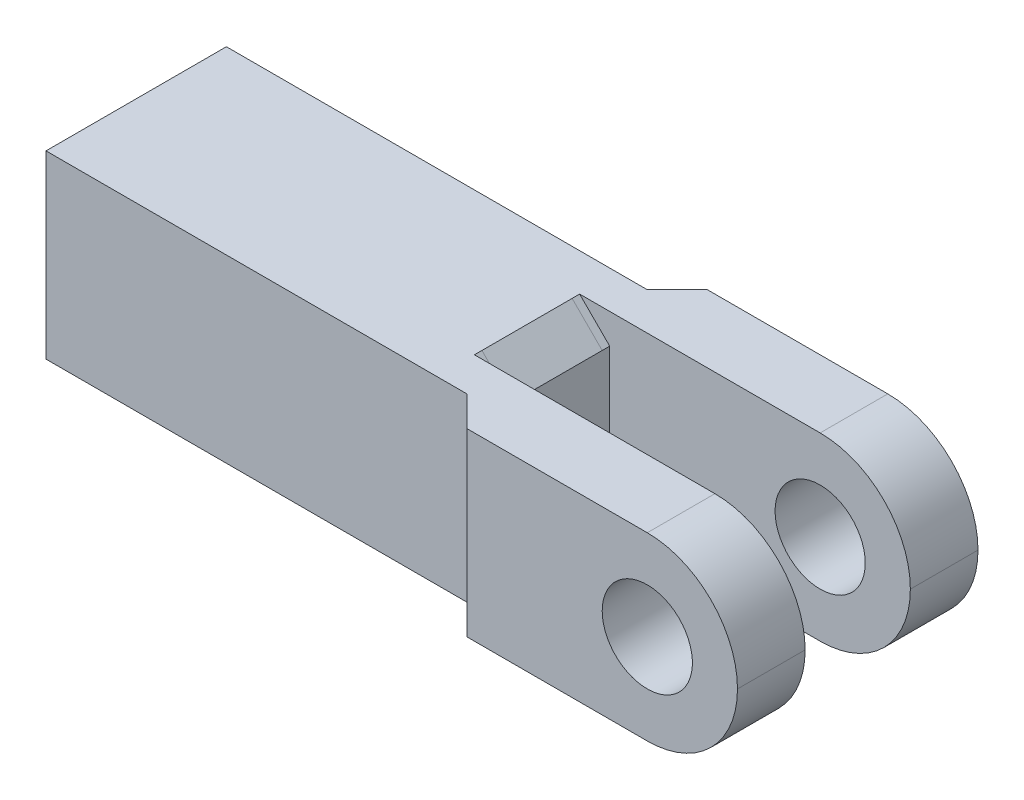
ISO-10303-21;
HEADER;
FILE_DESCRIPTION(('STEP AP214'),'2;1');
FILE_NAME('part.step','',(''),(''),'','','');
FILE_SCHEMA(('AUTOMOTIVE_DESIGN { 1 0 10303 214 1 1 1 1 }'));
ENDSEC;
DATA;
#1=APPLICATION_CONTEXT('core data for automotive mechanical design processes');
#2=APPLICATION_PROTOCOL_DEFINITION('international standard','automotive_design',2000,#1);
#3=PRODUCT_CONTEXT('',#1,'mechanical');
#4=PRODUCT('Part','Part','',(#3));
#5=PRODUCT_RELATED_PRODUCT_CATEGORY('part','',(#4));
#6=PRODUCT_DEFINITION_FORMATION('','',#4);
#7=PRODUCT_DEFINITION_CONTEXT('part definition',#1,'design');
#8=PRODUCT_DEFINITION('design','',#6,#7);
#9=PRODUCT_DEFINITION_SHAPE('','',#8);
#10=(LENGTH_UNIT() NAMED_UNIT(*) SI_UNIT(.MILLI.,.METRE.));
#11=(NAMED_UNIT(*) PLANE_ANGLE_UNIT() SI_UNIT($,.RADIAN.));
#12=(NAMED_UNIT(*) SI_UNIT($,.STERADIAN.) SOLID_ANGLE_UNIT());
#13=UNCERTAINTY_MEASURE_WITH_UNIT(LENGTH_MEASURE(1.E-05),#10,'distance_accuracy_value','');
#14=(GEOMETRIC_REPRESENTATION_CONTEXT(3) GLOBAL_UNCERTAINTY_ASSIGNED_CONTEXT((#13)) GLOBAL_UNIT_ASSIGNED_CONTEXT((#10,
#11,#12)) REPRESENTATION_CONTEXT('',''));
#15=CARTESIAN_POINT('',(0.,0.,0.));
#16=DIRECTION('',(0.,0.,1.));
#17=DIRECTION('',(1.,0.,0.));
#18=AXIS2_PLACEMENT_3D('',#15,#16,#17);
#19=CARTESIAN_POINT('',(14.,3.,3.));
#20=DIRECTION('',(0.,-1.,0.));
#21=DIRECTION('',(0.,0.,-1.));
#22=AXIS2_PLACEMENT_3D('',#19,#20,#21);
#23=PLANE('',#22);
#24=DIRECTION('',(0.,0.,-1.));
#25=VECTOR('',#24,1.);
#26=CARTESIAN_POINT('',(13.,3.,-1.5));
#27=LINE('',#26,#25);
#28=CARTESIAN_POINT('',(13.,3.,1.5));
#29=VERTEX_POINT('',#28);
#30=CARTESIAN_POINT('',(13.,3.,-1.5));
#31=VERTEX_POINT('',#30);
#32=EDGE_CURVE('E249',#29,#31,#27,.T.);
#33=ORIENTED_EDGE('',*,*,#32,.T.);
#34=DIRECTION('',(0.,0.,-1.));
#35=VECTOR('',#34,1.);
#36=CARTESIAN_POINT('',(13.,3.,-1.75));
#37=LINE('',#36,#35);
#38=CARTESIAN_POINT('',(13.,3.,-1.75));
#39=VERTEX_POINT('',#38);
#40=EDGE_CURVE('E296',#31,#39,#37,.T.);
#41=ORIENTED_EDGE('',*,*,#40,.T.);
#42=DIRECTION('',(-1.,0.,0.));
#43=VECTOR('',#42,1.);
#44=CARTESIAN_POINT('',(14.,3.,-1.75));
#45=LINE('',#44,#43);
#46=CARTESIAN_POINT('',(21.,3.,-1.75));
#47=VERTEX_POINT('',#46);
#48=EDGE_CURVE('E69',#47,#39,#45,.T.);
#49=ORIENTED_EDGE('',*,*,#48,.F.);
#50=DIRECTION('',(0.,0.,1.));
#51=VECTOR('',#50,1.);
#52=CARTESIAN_POINT('',(21.,3.,-4.));
#53=LINE('',#52,#51);
#54=CARTESIAN_POINT('',(21.,3.,-4.));
#55=VERTEX_POINT('',#54);
#56=EDGE_CURVE('E207',#47,#55,#53,.F.);
#57=ORIENTED_EDGE('',*,*,#56,.T.);
#58=DIRECTION('',(-1.,0.,0.));
#59=VECTOR('',#58,1.);
#60=CARTESIAN_POINT('',(24.,3.,-4.));
#61=LINE('',#60,#59);
#62=CARTESIAN_POINT('',(15.,3.,-4.));
#63=VERTEX_POINT('',#62);
#64=EDGE_CURVE('E211',#55,#63,#61,.T.);
#65=ORIENTED_EDGE('',*,*,#64,.T.);
#66=DIRECTION('',(0.707106781186546,0.,-0.707106781186549));
#67=VECTOR('',#66,1.);
#68=CARTESIAN_POINT('',(15.,3.,-4.));
#69=LINE('',#68,#67);
#70=CARTESIAN_POINT('',(14.,3.,-3.));
#71=VERTEX_POINT('',#70);
#72=EDGE_CURVE('E226',#63,#71,#69,.F.);
#73=ORIENTED_EDGE('',*,*,#72,.T.);
#74=DIRECTION('',(-1.,0.,0.));
#75=VECTOR('',#74,1.);
#76=CARTESIAN_POINT('',(14.,3.,-3.));
#77=LINE('',#76,#75);
#78=CARTESIAN_POINT('',(0.,3.,-3.));
#79=VERTEX_POINT('',#78);
#80=EDGE_CURVE('E376',#71,#79,#77,.T.);
#81=ORIENTED_EDGE('',*,*,#80,.T.);
#82=DIRECTION('',(0.,0.,1.));
#83=VECTOR('',#82,1.);
#84=CARTESIAN_POINT('',(0.,3.,3.));
#85=LINE('',#84,#83);
#86=CARTESIAN_POINT('',(0.,3.,3.));
#87=VERTEX_POINT('',#86);
#88=EDGE_CURVE('E363',#79,#87,#85,.T.);
#89=ORIENTED_EDGE('',*,*,#88,.T.);
#90=DIRECTION('',(-1.,0.,0.));
#91=VECTOR('',#90,1.);
#92=CARTESIAN_POINT('',(14.,3.,3.));
#93=LINE('',#92,#91);
#94=CARTESIAN_POINT('',(14.,3.,3.));
#95=VERTEX_POINT('',#94);
#96=EDGE_CURVE('E374',#95,#87,#93,.T.);
#97=ORIENTED_EDGE('',*,*,#96,.F.);
#98=DIRECTION('',(0.707106781186545,0.,0.70710678118655));
#99=VECTOR('',#98,1.);
#100=CARTESIAN_POINT('',(14.,3.,2.99999999999999));
#101=LINE('',#100,#99);
#102=CARTESIAN_POINT('',(15.,3.,4.));
#103=VERTEX_POINT('',#102);
#104=EDGE_CURVE('E239',#95,#103,#101,.T.);
#105=ORIENTED_EDGE('',*,*,#104,.T.);
#106=DIRECTION('',(-1.,0.,0.));
#107=VECTOR('',#106,1.);
#108=CARTESIAN_POINT('',(24.,3.,4.));
#109=LINE('',#108,#107);
#110=CARTESIAN_POINT('',(21.,3.,4.));
#111=VERTEX_POINT('',#110);
#112=EDGE_CURVE('E218',#111,#103,#109,.T.);
#113=ORIENTED_EDGE('',*,*,#112,.F.);
#114=DIRECTION('',(0.,0.,-1.));
#115=VECTOR('',#114,1.);
#116=CARTESIAN_POINT('',(21.,3.,1.5));
#117=LINE('',#116,#115);
#118=CARTESIAN_POINT('',(21.,3.,1.75));
#119=VERTEX_POINT('',#118);
#120=EDGE_CURVE('E237',#111,#119,#117,.T.);
#121=ORIENTED_EDGE('',*,*,#120,.T.);
#122=DIRECTION('',(1.,0.,0.));
#123=VECTOR('',#122,1.);
#124=CARTESIAN_POINT('',(14.,3.,1.75));
#125=LINE('',#124,#123);
#126=CARTESIAN_POINT('',(13.,3.,1.75));
#127=VERTEX_POINT('',#126);
#128=EDGE_CURVE('E77',#127,#119,#125,.T.);
#129=ORIENTED_EDGE('',*,*,#128,.F.);
#130=DIRECTION('',(0.,0.,-1.));
#131=VECTOR('',#130,1.);
#132=CARTESIAN_POINT('',(13.,3.,1.5));
#133=LINE('',#132,#131);
#134=EDGE_CURVE('E294',#127,#29,#133,.T.);
#135=ORIENTED_EDGE('',*,*,#134,.T.);
#136=EDGE_LOOP('',(#33,#41,#49,#57,#65,#73,#81,#89,#97,#105,#113,#121,#129,#135));
#137=FACE_BOUND('',#136,.T.);
#138=ADVANCED_FACE('F54',(#137),#23,.F.);
#139=CARTESIAN_POINT('',(14.,-3.,3.));
#140=DIRECTION('',(0.,1.,0.));
#141=DIRECTION('',(0.,0.,1.));
#142=AXIS2_PLACEMENT_3D('',#139,#140,#141);
#143=PLANE('',#142);
#144=DIRECTION('',(0.,0.,1.));
#145=VECTOR('',#144,1.);
#146=CARTESIAN_POINT('',(13.,-3.,1.5));
#147=LINE('',#146,#145);
#148=CARTESIAN_POINT('',(13.,-3.,-1.5));
#149=VERTEX_POINT('',#148);
#150=CARTESIAN_POINT('',(13.,-3.,1.5));
#151=VERTEX_POINT('',#150);
#152=EDGE_CURVE('E256',#149,#151,#147,.T.);
#153=ORIENTED_EDGE('',*,*,#152,.T.);
#154=DIRECTION('',(0.,0.,1.));
#155=VECTOR('',#154,1.);
#156=CARTESIAN_POINT('',(13.,-3.,1.75));
#157=LINE('',#156,#155);
#158=CARTESIAN_POINT('',(13.,-3.,1.75));
#159=VERTEX_POINT('',#158);
#160=EDGE_CURVE('E291',#151,#159,#157,.T.);
#161=ORIENTED_EDGE('',*,*,#160,.T.);
#162=DIRECTION('',(-1.,0.,0.));
#163=VECTOR('',#162,1.);
#164=CARTESIAN_POINT('',(14.,-3.,1.75));
#165=LINE('',#164,#163);
#166=CARTESIAN_POINT('',(21.,-3.,1.75));
#167=VERTEX_POINT('',#166);
#168=EDGE_CURVE('E335',#167,#159,#165,.T.);
#169=ORIENTED_EDGE('',*,*,#168,.F.);
#170=DIRECTION('',(0.,0.,1.));
#171=VECTOR('',#170,1.);
#172=CARTESIAN_POINT('',(21.,-3.,4.));
#173=LINE('',#172,#171);
#174=CARTESIAN_POINT('',(21.,-3.,4.));
#175=VERTEX_POINT('',#174);
#176=EDGE_CURVE('E230',#167,#175,#173,.T.);
#177=ORIENTED_EDGE('',*,*,#176,.T.);
#178=DIRECTION('',(-1.,0.,0.));
#179=VECTOR('',#178,1.);
#180=CARTESIAN_POINT('',(24.,-3.,4.));
#181=LINE('',#180,#179);
#182=CARTESIAN_POINT('',(15.,-3.,4.));
#183=VERTEX_POINT('',#182);
#184=EDGE_CURVE('E242',#175,#183,#181,.T.);
#185=ORIENTED_EDGE('',*,*,#184,.T.);
#186=DIRECTION('',(-0.707106781186545,0.,-0.70710678118655));
#187=VECTOR('',#186,1.);
#188=CARTESIAN_POINT('',(14.,-3.,2.99999999999999));
#189=LINE('',#188,#187);
#190=CARTESIAN_POINT('',(14.,-3.,3.));
#191=VERTEX_POINT('',#190);
#192=EDGE_CURVE('E247',#183,#191,#189,.T.);
#193=ORIENTED_EDGE('',*,*,#192,.T.);
#194=DIRECTION('',(-1.,0.,0.));
#195=VECTOR('',#194,1.);
#196=CARTESIAN_POINT('',(14.,-3.,3.));
#197=LINE('',#196,#195);
#198=CARTESIAN_POINT('',(0.,-3.,3.));
#199=VERTEX_POINT('',#198);
#200=EDGE_CURVE('E372',#191,#199,#197,.T.);
#201=ORIENTED_EDGE('',*,*,#200,.T.);
#202=DIRECTION('',(0.,0.,-1.));
#203=VECTOR('',#202,1.);
#204=CARTESIAN_POINT('',(0.,-3.,3.));
#205=LINE('',#204,#203);
#206=CARTESIAN_POINT('',(0.,-3.,-3.));
#207=VERTEX_POINT('',#206);
#208=EDGE_CURVE('E357',#199,#207,#205,.T.);
#209=ORIENTED_EDGE('',*,*,#208,.T.);
#210=DIRECTION('',(-1.,0.,0.));
#211=VECTOR('',#210,1.);
#212=CARTESIAN_POINT('',(14.,-3.,-3.));
#213=LINE('',#212,#211);
#214=CARTESIAN_POINT('',(14.,-3.,-3.));
#215=VERTEX_POINT('',#214);
#216=EDGE_CURVE('E360',#215,#207,#213,.T.);
#217=ORIENTED_EDGE('',*,*,#216,.F.);
#218=DIRECTION('',(-0.707106781186546,0.,0.707106781186549));
#219=VECTOR('',#218,1.);
#220=CARTESIAN_POINT('',(15.,-3.,-4.00000000000001));
#221=LINE('',#220,#219);
#222=CARTESIAN_POINT('',(15.,-3.,-4.00000000000001));
#223=VERTEX_POINT('',#222);
#224=EDGE_CURVE('E228',#215,#223,#221,.F.);
#225=ORIENTED_EDGE('',*,*,#224,.T.);
#226=DIRECTION('',(-1.,0.,0.));
#227=VECTOR('',#226,1.);
#228=CARTESIAN_POINT('',(24.,-3.,-4.00000000000001));
#229=LINE('',#228,#227);
#230=CARTESIAN_POINT('',(21.,-3.,-4.00000000000001));
#231=VERTEX_POINT('',#230);
#232=EDGE_CURVE('E215',#231,#223,#229,.T.);
#233=ORIENTED_EDGE('',*,*,#232,.F.);
#234=DIRECTION('',(0.,0.,-1.));
#235=VECTOR('',#234,1.);
#236=CARTESIAN_POINT('',(21.,-3.,-1.5));
#237=LINE('',#236,#235);
#238=CARTESIAN_POINT('',(21.,-3.,-1.75));
#239=VERTEX_POINT('',#238);
#240=EDGE_CURVE('E381',#231,#239,#237,.F.);
#241=ORIENTED_EDGE('',*,*,#240,.T.);
#242=DIRECTION('',(1.,0.,0.));
#243=VECTOR('',#242,1.);
#244=CARTESIAN_POINT('',(14.,-3.,-1.75));
#245=LINE('',#244,#243);
#246=CARTESIAN_POINT('',(13.,-3.,-1.75));
#247=VERTEX_POINT('',#246);
#248=EDGE_CURVE('E193',#247,#239,#245,.T.);
#249=ORIENTED_EDGE('',*,*,#248,.F.);
#250=DIRECTION('',(0.,0.,1.));
#251=VECTOR('',#250,1.);
#252=CARTESIAN_POINT('',(13.,-3.,-1.5));
#253=LINE('',#252,#251);
#254=EDGE_CURVE('E289',#247,#149,#253,.T.);
#255=ORIENTED_EDGE('',*,*,#254,.T.);
#256=EDGE_LOOP('',(#153,#161,#169,#177,#185,#193,#201,#209,#217,#225,#233,#241,#249,#255));
#257=FACE_BOUND('',#256,.T.);
#258=ADVANCED_FACE('F413',(#257),#143,.F.);
#259=CARTESIAN_POINT('',(21.,0.,0.));
#260=DIRECTION('',(0.,0.,-1.));
#261=DIRECTION('',(-1.,0.,0.));
#262=AXIS2_PLACEMENT_3D('',#259,#260,#261);
#263=CYLINDRICAL_SURFACE('',#262,3.);
#264=ORIENTED_EDGE('',*,*,#56,.F.);
#265=CARTESIAN_POINT('',(21.,0.,-1.75));
#266=DIRECTION('',(0.,0.,1.));
#267=DIRECTION('',(1.,0.,0.));
#268=AXIS2_PLACEMENT_3D('',#265,#266,#267);
#269=CIRCLE('',#268,3.);
#270=CARTESIAN_POINT('',(24.,0.,-1.75));
#271=VERTEX_POINT('',#270);
#272=EDGE_CURVE('E191',#47,#271,#269,.F.);
#273=ORIENTED_EDGE('',*,*,#272,.T.);
#274=DIRECTION('',(0.,0.,1.));
#275=VECTOR('',#274,1.);
#276=CARTESIAN_POINT('',(24.,0.,-1.5));
#277=LINE('',#276,#275);
#278=CARTESIAN_POINT('',(24.,0.,-4.));
#279=VERTEX_POINT('',#278);
#280=EDGE_CURVE('E205',#279,#271,#277,.T.);
#281=ORIENTED_EDGE('',*,*,#280,.F.);
#282=CARTESIAN_POINT('',(21.,0.,-4.));
#283=DIRECTION('',(0.,0.,1.));
#284=DIRECTION('',(1.,0.,0.));
#285=AXIS2_PLACEMENT_3D('',#282,#283,#284);
#286=CIRCLE('',#285,3.);
#287=EDGE_CURVE('E379',#55,#279,#286,.F.);
#288=ORIENTED_EDGE('',*,*,#287,.F.);
#289=EDGE_LOOP('',(#264,#273,#281,#288));
#290=FACE_BOUND('',#289,.T.);
#291=ADVANCED_FACE('F203',(#290),#263,.T.);
#292=CARTESIAN_POINT('',(21.,0.,0.));
#293=DIRECTION('',(0.,0.,1.));
#294=DIRECTION('',(1.,0.,0.));
#295=AXIS2_PLACEMENT_3D('',#292,#293,#294);
#296=CYLINDRICAL_SURFACE('',#295,3.);
#297=ORIENTED_EDGE('',*,*,#280,.T.);
#298=CARTESIAN_POINT('',(21.,0.,-1.75));
#299=DIRECTION('',(0.,0.,1.));
#300=DIRECTION('',(1.,0.,0.));
#301=AXIS2_PLACEMENT_3D('',#298,#299,#300);
#302=CIRCLE('',#301,3.);
#303=EDGE_CURVE('E188',#271,#239,#302,.F.);
#304=ORIENTED_EDGE('',*,*,#303,.T.);
#305=ORIENTED_EDGE('',*,*,#240,.F.);
#306=CARTESIAN_POINT('',(21.,0.,-4.));
#307=DIRECTION('',(0.,0.,1.));
#308=DIRECTION('',(1.,0.,0.));
#309=AXIS2_PLACEMENT_3D('',#306,#307,#308);
#310=CIRCLE('',#309,3.);
#311=EDGE_CURVE('E210',#279,#231,#310,.F.);
#312=ORIENTED_EDGE('',*,*,#311,.F.);
#313=EDGE_LOOP('',(#297,#304,#305,#312));
#314=FACE_BOUND('',#313,.T.);
#315=ADVANCED_FACE('F209',(#314),#296,.T.);
#316=CARTESIAN_POINT('',(21.,0.,6.));
#317=DIRECTION('',(0.,0.,-1.));
#318=DIRECTION('',(-1.,0.,0.));
#319=AXIS2_PLACEMENT_3D('',#316,#317,#318);
#320=CYLINDRICAL_SURFACE('',#319,1.5);
#321=CARTESIAN_POINT('',(21.,0.,-4.));
#322=DIRECTION('',(0.,0.,-1.));
#323=DIRECTION('',(-1.,0.,0.));
#324=AXIS2_PLACEMENT_3D('',#321,#322,#323);
#325=CIRCLE('',#324,1.5);
#326=CARTESIAN_POINT('',(19.5,0.,-4.));
#327=VERTEX_POINT('',#326);
#328=EDGE_CURVE('E212',#327,#327,#325,.T.);
#329=ORIENTED_EDGE('',*,*,#328,.T.);
#330=EDGE_LOOP('',(#329));
#331=FACE_BOUND('',#330,.T.);
#332=CARTESIAN_POINT('',(21.,0.,-1.75));
#333=DIRECTION('',(0.,0.,1.));
#334=DIRECTION('',(1.,0.,0.));
#335=AXIS2_PLACEMENT_3D('',#332,#333,#334);
#336=CIRCLE('',#335,1.5);
#337=CARTESIAN_POINT('',(22.5,0.,-1.75));
#338=VERTEX_POINT('',#337);
#339=EDGE_CURVE('E198',#338,#338,#336,.F.);
#340=ORIENTED_EDGE('',*,*,#339,.F.);
#341=EDGE_LOOP('',(#340));
#342=FACE_BOUND('',#341,.T.);
#343=ADVANCED_FACE('F455',(#331,#342),#320,.F.);
#344=CARTESIAN_POINT('',(21.,0.,3.));
#345=DIRECTION('',(0.,0.,1.));
#346=DIRECTION('',(1.,0.,0.));
#347=AXIS2_PLACEMENT_3D('',#344,#345,#346);
#348=CYLINDRICAL_SURFACE('',#347,3.);
#349=DIRECTION('',(0.,0.,-1.));
#350=VECTOR('',#349,1.);
#351=CARTESIAN_POINT('',(24.,0.,4.));
#352=LINE('',#351,#350);
#353=CARTESIAN_POINT('',(24.,0.,1.75));
#354=VERTEX_POINT('',#353);
#355=CARTESIAN_POINT('',(24.,0.,4.));
#356=VERTEX_POINT('',#355);
#357=EDGE_CURVE('E240',#354,#356,#352,.F.);
#358=ORIENTED_EDGE('',*,*,#357,.F.);
#359=CARTESIAN_POINT('',(21.,0.,1.75));
#360=DIRECTION('',(0.,0.,-1.));
#361=DIRECTION('',(-1.,0.,0.));
#362=AXIS2_PLACEMENT_3D('',#359,#360,#361);
#363=CIRCLE('',#362,3.);
#364=EDGE_CURVE('E332',#354,#119,#363,.F.);
#365=ORIENTED_EDGE('',*,*,#364,.T.);
#366=ORIENTED_EDGE('',*,*,#120,.F.);
#367=CARTESIAN_POINT('',(21.,0.,4.));
#368=DIRECTION('',(0.,0.,1.));
#369=DIRECTION('',(1.,0.,0.));
#370=AXIS2_PLACEMENT_3D('',#367,#368,#369);
#371=CIRCLE('',#370,3.);
#372=EDGE_CURVE('E232',#356,#111,#371,.T.);
#373=ORIENTED_EDGE('',*,*,#372,.F.);
#374=EDGE_LOOP('',(#358,#365,#366,#373));
#375=FACE_BOUND('',#374,.T.);
#376=ADVANCED_FACE('F423',(#375),#348,.T.);
#377=CARTESIAN_POINT('',(21.,0.,3.));
#378=DIRECTION('',(0.,0.,-1.));
#379=DIRECTION('',(-1.,0.,0.));
#380=AXIS2_PLACEMENT_3D('',#377,#378,#379);
#381=CYLINDRICAL_SURFACE('',#380,3.);
#382=ORIENTED_EDGE('',*,*,#176,.F.);
#383=CARTESIAN_POINT('',(21.,0.,1.75));
#384=DIRECTION('',(0.,0.,-1.));
#385=DIRECTION('',(-1.,0.,0.));
#386=AXIS2_PLACEMENT_3D('',#383,#384,#385);
#387=CIRCLE('',#386,3.);
#388=EDGE_CURVE('E273',#167,#354,#387,.F.);
#389=ORIENTED_EDGE('',*,*,#388,.T.);
#390=ORIENTED_EDGE('',*,*,#357,.T.);
#391=CARTESIAN_POINT('',(21.,0.,4.));
#392=DIRECTION('',(0.,0.,1.));
#393=DIRECTION('',(1.,0.,0.));
#394=AXIS2_PLACEMENT_3D('',#391,#392,#393);
#395=CIRCLE('',#394,3.);
#396=EDGE_CURVE('E234',#175,#356,#395,.T.);
#397=ORIENTED_EDGE('',*,*,#396,.F.);
#398=EDGE_LOOP('',(#382,#389,#390,#397));
#399=FACE_BOUND('',#398,.T.);
#400=ADVANCED_FACE('F418',(#399),#381,.T.);
#401=CARTESIAN_POINT('',(21.,0.,-6.));
#402=DIRECTION('',(0.,0.,1.));
#403=DIRECTION('',(1.,0.,0.));
#404=AXIS2_PLACEMENT_3D('',#401,#402,#403);
#405=CYLINDRICAL_SURFACE('',#404,1.5);
#406=CARTESIAN_POINT('',(21.,0.,4.));
#407=DIRECTION('',(0.,0.,-1.));
#408=DIRECTION('',(-1.,0.,0.));
#409=AXIS2_PLACEMENT_3D('',#406,#407,#408);
#410=CIRCLE('',#409,1.5);
#411=CARTESIAN_POINT('',(19.5,0.,4.));
#412=VERTEX_POINT('',#411);
#413=EDGE_CURVE('E243',#412,#412,#410,.T.);
#414=ORIENTED_EDGE('',*,*,#413,.F.);
#415=EDGE_LOOP('',(#414));
#416=FACE_BOUND('',#415,.T.);
#417=CARTESIAN_POINT('',(21.,0.,1.75));
#418=DIRECTION('',(0.,0.,-1.));
#419=DIRECTION('',(-1.,0.,0.));
#420=AXIS2_PLACEMENT_3D('',#417,#418,#419);
#421=CIRCLE('',#420,1.5);
#422=CARTESIAN_POINT('',(19.5,0.,1.75));
#423=VERTEX_POINT('',#422);
#424=EDGE_CURVE('E270',#423,#423,#421,.T.);
#425=ORIENTED_EDGE('',*,*,#424,.T.);
#426=EDGE_LOOP('',(#425));
#427=FACE_BOUND('',#426,.T.);
#428=ADVANCED_FACE('F452',(#416,#427),#405,.F.);
#429=CARTESIAN_POINT('',(14.,3.,-3.));
#430=DIRECTION('',(0.,0.,1.));
#431=DIRECTION('',(1.,0.,0.));
#432=AXIS2_PLACEMENT_3D('',#429,#430,#431);
#433=PLANE('',#432);
#434=DIRECTION('',(0.,1.,0.));
#435=VECTOR('',#434,1.);
#436=CARTESIAN_POINT('',(0.,3.,-3.));
#437=LINE('',#436,#435);
#438=EDGE_CURVE('E352',#207,#79,#437,.T.);
#439=ORIENTED_EDGE('',*,*,#438,.T.);
#440=ORIENTED_EDGE('',*,*,#80,.F.);
#441=DIRECTION('',(0.,1.,0.));
#442=VECTOR('',#441,1.);
#443=CARTESIAN_POINT('',(14.,3.,-3.));
#444=LINE('',#443,#442);
#445=EDGE_CURVE('E353',#215,#71,#444,.T.);
#446=ORIENTED_EDGE('',*,*,#445,.F.);
#447=ORIENTED_EDGE('',*,*,#216,.T.);
#448=EDGE_LOOP('',(#439,#440,#446,#447));
#449=FACE_BOUND('',#448,.T.);
#450=ADVANCED_FACE('F394',(#449),#433,.F.);
#451=CARTESIAN_POINT('',(14.,3.,3.));
#452=DIRECTION('',(0.,0.,-1.));
#453=DIRECTION('',(0.,1.,0.));
#454=AXIS2_PLACEMENT_3D('',#451,#452,#453);
#455=PLANE('',#454);
#456=ORIENTED_EDGE('',*,*,#200,.F.);
#457=DIRECTION('',(0.,-1.,0.));
#458=VECTOR('',#457,1.);
#459=CARTESIAN_POINT('',(14.,3.,3.));
#460=LINE('',#459,#458);
#461=EDGE_CURVE('E356',#95,#191,#460,.T.);
#462=ORIENTED_EDGE('',*,*,#461,.F.);
#463=ORIENTED_EDGE('',*,*,#96,.T.);
#464=DIRECTION('',(0.,-1.,0.));
#465=VECTOR('',#464,1.);
#466=CARTESIAN_POINT('',(0.,3.,3.));
#467=LINE('',#466,#465);
#468=EDGE_CURVE('E366',#87,#199,#467,.T.);
#469=ORIENTED_EDGE('',*,*,#468,.T.);
#470=EDGE_LOOP('',(#456,#462,#463,#469));
#471=FACE_BOUND('',#470,.T.);
#472=ADVANCED_FACE('F405',(#471),#455,.F.);
#473=CARTESIAN_POINT('',(14.,0.,0.));
#474=DIRECTION('',(1.,0.,0.));
#475=DIRECTION('',(0.,0.,-1.));
#476=AXIS2_PLACEMENT_3D('',#473,#474,#475);
#477=PLANE('',#476);
#478=DIRECTION('',(0.,-1.,0.));
#479=VECTOR('',#478,1.);
#480=CARTESIAN_POINT('',(14.,10.,1.75));
#481=LINE('',#480,#479);
#482=CARTESIAN_POINT('',(14.,2.,1.75));
#483=VERTEX_POINT('',#482);
#484=CARTESIAN_POINT('',(14.,-1.99999999999999,1.75));
#485=VERTEX_POINT('',#484);
#486=EDGE_CURVE('E274',#483,#485,#481,.T.);
#487=ORIENTED_EDGE('',*,*,#486,.T.);
#488=DIRECTION('',(0.,0.,-1.));
#489=VECTOR('',#488,1.);
#490=CARTESIAN_POINT('',(14.,-1.99999999999999,1.5));
#491=LINE('',#490,#489);
#492=CARTESIAN_POINT('',(14.,-2.,1.5));
#493=VERTEX_POINT('',#492);
#494=EDGE_CURVE('E286',#485,#493,#491,.T.);
#495=ORIENTED_EDGE('',*,*,#494,.T.);
#496=DIRECTION('',(0.,0.,-1.));
#497=VECTOR('',#496,1.);
#498=CARTESIAN_POINT('',(14.,-2.,-1.5));
#499=LINE('',#498,#497);
#500=CARTESIAN_POINT('',(14.,-2.,-1.5));
#501=VERTEX_POINT('',#500);
#502=EDGE_CURVE('E252',#493,#501,#499,.T.);
#503=ORIENTED_EDGE('',*,*,#502,.T.);
#504=DIRECTION('',(0.,0.,-1.));
#505=VECTOR('',#504,1.);
#506=CARTESIAN_POINT('',(14.,-2.,-1.75));
#507=LINE('',#506,#505);
#508=CARTESIAN_POINT('',(14.,-2.,-1.75));
#509=VERTEX_POINT('',#508);
#510=EDGE_CURVE('E283',#501,#509,#507,.T.);
#511=ORIENTED_EDGE('',*,*,#510,.T.);
#512=DIRECTION('',(0.,-1.,0.));
#513=VECTOR('',#512,1.);
#514=CARTESIAN_POINT('',(14.,10.,-1.75));
#515=LINE('',#514,#513);
#516=CARTESIAN_POINT('',(14.,2.,-1.75));
#517=VERTEX_POINT('',#516);
#518=EDGE_CURVE('E277',#517,#509,#515,.T.);
#519=ORIENTED_EDGE('',*,*,#518,.F.);
#520=DIRECTION('',(0.,0.,1.));
#521=VECTOR('',#520,1.);
#522=CARTESIAN_POINT('',(14.,2.,-1.5));
#523=LINE('',#522,#521);
#524=CARTESIAN_POINT('',(14.,2.,-1.5));
#525=VERTEX_POINT('',#524);
#526=EDGE_CURVE('E280',#517,#525,#523,.T.);
#527=ORIENTED_EDGE('',*,*,#526,.T.);
#528=DIRECTION('',(0.,0.,1.));
#529=VECTOR('',#528,1.);
#530=CARTESIAN_POINT('',(14.,2.,1.5));
#531=LINE('',#530,#529);
#532=CARTESIAN_POINT('',(14.,2.,1.5));
#533=VERTEX_POINT('',#532);
#534=EDGE_CURVE('E254',#525,#533,#531,.T.);
#535=ORIENTED_EDGE('',*,*,#534,.T.);
#536=DIRECTION('',(0.,0.,1.));
#537=VECTOR('',#536,1.);
#538=CARTESIAN_POINT('',(14.,2.,1.75));
#539=LINE('',#538,#537);
#540=EDGE_CURVE('E269',#533,#483,#539,.T.);
#541=ORIENTED_EDGE('',*,*,#540,.T.);
#542=EDGE_LOOP('',(#487,#495,#503,#511,#519,#527,#535,#541));
#543=FACE_BOUND('',#542,.T.);
#544=ADVANCED_FACE('F309',(#543),#477,.T.);
#545=CARTESIAN_POINT('',(0.,0.,0.));
#546=DIRECTION('',(1.,0.,0.));
#547=DIRECTION('',(0.,0.,-1.));
#548=AXIS2_PLACEMENT_3D('',#545,#546,#547);
#549=PLANE('',#548);
#550=CARTESIAN_POINT('',(0.,0.,0.));
#551=DIRECTION('',(-1.,0.,0.));
#552=DIRECTION('',(0.,0.,1.));
#553=AXIS2_PLACEMENT_3D('',#550,#551,#552);
#554=CIRCLE('',#553,1.25);
#555=CARTESIAN_POINT('',(0.,0.,1.25));
#556=VERTEX_POINT('',#555);
#557=EDGE_CURVE('E338',#556,#556,#554,.T.);
#558=ORIENTED_EDGE('',*,*,#557,.F.);
#559=EDGE_LOOP('',(#558));
#560=FACE_BOUND('',#559,.T.);
#561=ORIENTED_EDGE('',*,*,#438,.F.);
#562=ORIENTED_EDGE('',*,*,#208,.F.);
#563=ORIENTED_EDGE('',*,*,#468,.F.);
#564=ORIENTED_EDGE('',*,*,#88,.F.);
#565=EDGE_LOOP('',(#561,#562,#563,#564));
#566=FACE_BOUND('',#565,.T.);
#567=ADVANCED_FACE('F398',(#560,#566),#549,.F.);
#568=CARTESIAN_POINT('',(24.,0.,-4.));
#569=DIRECTION('',(0.,0.,1.));
#570=DIRECTION('',(1.,0.,0.));
#571=AXIS2_PLACEMENT_3D('',#568,#569,#570);
#572=PLANE('',#571);
#573=ORIENTED_EDGE('',*,*,#328,.F.);
#574=EDGE_LOOP('',(#573));
#575=FACE_BOUND('',#574,.T.);
#576=ORIENTED_EDGE('',*,*,#232,.T.);
#577=DIRECTION('',(0.,1.,0.));
#578=VECTOR('',#577,1.);
#579=CARTESIAN_POINT('',(15.,0.,-4.));
#580=LINE('',#579,#578);
#581=EDGE_CURVE('E223',#223,#63,#580,.T.);
#582=ORIENTED_EDGE('',*,*,#581,.T.);
#583=ORIENTED_EDGE('',*,*,#64,.F.);
#584=ORIENTED_EDGE('',*,*,#287,.T.);
#585=ORIENTED_EDGE('',*,*,#311,.T.);
#586=EDGE_LOOP('',(#576,#582,#583,#584,#585));
#587=FACE_BOUND('',#586,.T.);
#588=ADVANCED_FACE('F386',(#575,#587),#572,.F.);
#589=CARTESIAN_POINT('',(15.,0.,-4.));
#590=DIRECTION('',(0.707106781186549,0.,0.707106781186547));
#591=DIRECTION('',(0.,1.,0.));
#592=AXIS2_PLACEMENT_3D('',#589,#590,#591);
#593=PLANE('',#592);
#594=ORIENTED_EDGE('',*,*,#224,.F.);
#595=ORIENTED_EDGE('',*,*,#445,.T.);
#596=ORIENTED_EDGE('',*,*,#72,.F.);
#597=ORIENTED_EDGE('',*,*,#581,.F.);
#598=EDGE_LOOP('',(#594,#595,#596,#597));
#599=FACE_BOUND('',#598,.T.);
#600=ADVANCED_FACE('F390',(#599),#593,.F.);
#601=CARTESIAN_POINT('',(24.,0.,4.));
#602=DIRECTION('',(0.,0.,1.));
#603=DIRECTION('',(1.,0.,0.));
#604=AXIS2_PLACEMENT_3D('',#601,#602,#603);
#605=PLANE('',#604);
#606=ORIENTED_EDGE('',*,*,#413,.T.);
#607=EDGE_LOOP('',(#606));
#608=FACE_BOUND('',#607,.T.);
#609=ORIENTED_EDGE('',*,*,#112,.T.);
#610=DIRECTION('',(0.,-1.,0.));
#611=VECTOR('',#610,1.);
#612=CARTESIAN_POINT('',(15.,-3.,4.));
#613=LINE('',#612,#611);
#614=EDGE_CURVE('E245',#103,#183,#613,.T.);
#615=ORIENTED_EDGE('',*,*,#614,.T.);
#616=ORIENTED_EDGE('',*,*,#184,.F.);
#617=ORIENTED_EDGE('',*,*,#396,.T.);
#618=ORIENTED_EDGE('',*,*,#372,.T.);
#619=EDGE_LOOP('',(#609,#615,#616,#617,#618));
#620=FACE_BOUND('',#619,.T.);
#621=ADVANCED_FACE('F412',(#608,#620),#605,.T.);
#622=CARTESIAN_POINT('',(14.,0.,2.99999999999999));
#623=DIRECTION('',(-0.70710678118655,0.,0.707106781186545));
#624=DIRECTION('',(0.,-1.,0.));
#625=AXIS2_PLACEMENT_3D('',#622,#623,#624);
#626=PLANE('',#625);
#627=ORIENTED_EDGE('',*,*,#192,.F.);
#628=ORIENTED_EDGE('',*,*,#614,.F.);
#629=ORIENTED_EDGE('',*,*,#104,.F.);
#630=ORIENTED_EDGE('',*,*,#461,.T.);
#631=EDGE_LOOP('',(#627,#628,#629,#630));
#632=FACE_BOUND('',#631,.T.);
#633=ADVANCED_FACE('F408',(#632),#626,.T.);
#634=CARTESIAN_POINT('',(13.,0.,0.));
#635=DIRECTION('',(-1.,0.,0.));
#636=DIRECTION('',(0.,0.,1.));
#637=AXIS2_PLACEMENT_3D('',#634,#635,#636);
#638=CYLINDRICAL_SURFACE('',#637,1.25);
#639=CARTESIAN_POINT('',(13.,0.,0.));
#640=DIRECTION('',(-1.,0.,0.));
#641=DIRECTION('',(0.,0.,1.));
#642=AXIS2_PLACEMENT_3D('',#639,#640,#641);
#643=CIRCLE('',#642,1.25);
#644=CARTESIAN_POINT('',(13.,0.,1.25));
#645=VERTEX_POINT('',#644);
#646=EDGE_CURVE('E339',#645,#645,#643,.T.);
#647=CARTESIAN_POINT('',(13.,0.,1.25));
#648=CARTESIAN_POINT('',(12.8645833333333,0.,1.25));
#649=CARTESIAN_POINT('',(12.7291666666667,0.,1.25));
#650=CARTESIAN_POINT('',(12.4583333333333,0.,1.25));
#651=CARTESIAN_POINT('',(12.3229166666667,0.,1.25));
#652=CARTESIAN_POINT('',(12.0520833333333,0.,1.25));
#653=CARTESIAN_POINT('',(11.9166666666667,0.,1.25));
#654=CARTESIAN_POINT('',(11.6458333333333,0.,1.25));
#655=CARTESIAN_POINT('',(11.5104166666667,0.,1.25));
#656=CARTESIAN_POINT('',(11.2395833333333,0.,1.25));
#657=CARTESIAN_POINT('',(11.1041666666667,0.,1.25));
#658=CARTESIAN_POINT('',(10.8333333333333,0.,1.25));
#659=CARTESIAN_POINT('',(10.6979166666667,0.,1.25));
#660=CARTESIAN_POINT('',(10.4270833333333,0.,1.25));
#661=CARTESIAN_POINT('',(10.2916666666667,0.,1.25));
#662=CARTESIAN_POINT('',(10.0208333333333,0.,1.25));
#663=CARTESIAN_POINT('',(9.88541666666666,0.,1.25));
#664=CARTESIAN_POINT('',(9.61458333333333,0.,1.25));
#665=CARTESIAN_POINT('',(9.47916666666666,0.,1.25));
#666=CARTESIAN_POINT('',(9.20833333333333,0.,1.25));
#667=CARTESIAN_POINT('',(9.07291666666666,0.,1.25));
#668=CARTESIAN_POINT('',(8.80208333333333,0.,1.25));
#669=CARTESIAN_POINT('',(8.66666666666666,0.,1.25));
#670=CARTESIAN_POINT('',(8.39583333333333,0.,1.25));
#671=CARTESIAN_POINT('',(8.26041666666666,0.,1.25));
#672=CARTESIAN_POINT('',(7.98958333333333,0.,1.25));
#673=CARTESIAN_POINT('',(7.85416666666666,0.,1.25));
#674=CARTESIAN_POINT('',(7.58333333333333,0.,1.25));
#675=CARTESIAN_POINT('',(7.44791666666666,0.,1.25));
#676=CARTESIAN_POINT('',(7.17708333333333,0.,1.25));
#677=CARTESIAN_POINT('',(7.04166666666666,0.,1.25));
#678=CARTESIAN_POINT('',(6.77083333333333,0.,1.25));
#679=CARTESIAN_POINT('',(6.63541666666666,0.,1.25));
#680=CARTESIAN_POINT('',(6.36458333333333,0.,1.25));
#681=CARTESIAN_POINT('',(6.22916666666666,0.,1.25));
#682=CARTESIAN_POINT('',(5.95833333333333,0.,1.25));
#683=CARTESIAN_POINT('',(5.82291666666666,0.,1.25));
#684=CARTESIAN_POINT('',(5.55208333333333,0.,1.25));
#685=CARTESIAN_POINT('',(5.41666666666666,0.,1.25));
#686=CARTESIAN_POINT('',(5.14583333333333,0.,1.25));
#687=CARTESIAN_POINT('',(5.01041666666667,0.,1.25));
#688=CARTESIAN_POINT('',(4.73958333333333,0.,1.25));
#689=CARTESIAN_POINT('',(4.60416666666667,0.,1.25));
#690=CARTESIAN_POINT('',(4.33333333333333,0.,1.25));
#691=CARTESIAN_POINT('',(4.19791666666667,0.,1.25));
#692=CARTESIAN_POINT('',(3.92708333333333,0.,1.25));
#693=CARTESIAN_POINT('',(3.79166666666667,0.,1.25));
#694=CARTESIAN_POINT('',(3.52083333333333,0.,1.25));
#695=CARTESIAN_POINT('',(3.38541666666666,0.,1.25));
#696=CARTESIAN_POINT('',(3.11458333333333,0.,1.25));
#697=CARTESIAN_POINT('',(2.97916666666667,0.,1.25));
#698=CARTESIAN_POINT('',(2.70833333333333,0.,1.25));
#699=CARTESIAN_POINT('',(2.57291666666667,0.,1.25));
#700=CARTESIAN_POINT('',(2.30208333333333,0.,1.25));
#701=CARTESIAN_POINT('',(2.16666666666667,0.,1.25));
#702=CARTESIAN_POINT('',(1.89583333333333,0.,1.25));
#703=CARTESIAN_POINT('',(1.76041666666666,0.,1.25));
#704=CARTESIAN_POINT('',(1.48958333333333,0.,1.25));
#705=CARTESIAN_POINT('',(1.35416666666666,0.,1.25));
#706=CARTESIAN_POINT('',(1.08333333333333,0.,1.25));
#707=CARTESIAN_POINT('',(0.947916666666665,0.,1.25));
#708=CARTESIAN_POINT('',(0.677083333333332,0.,1.25));
#709=CARTESIAN_POINT('',(0.541666666666665,0.,1.25));
#710=CARTESIAN_POINT('',(0.270833333333332,0.,1.25));
#711=CARTESIAN_POINT('',(0.135416666666665,0.,1.25));
#712=CARTESIAN_POINT('',(0.,0.,1.25));
#713=B_SPLINE_CURVE_WITH_KNOTS('',3,(#647,#648,#649,#650,#651,#652,#653,#654,#655,#656,#657,
#658,#659,#660,#661,#662,#663,#664,#665,#666,#667,#668,#669,#670,#671,#672,#673,#674,#675,#676,
#677,#678,#679,#680,#681,#682,#683,#684,#685,#686,#687,#688,#689,#690,#691,#692,#693,#694,#695,
#696,#697,#698,#699,#700,#701,#702,#703,#704,#705,#706,#707,#708,#709,#710,#711,#712),
.UNSPECIFIED.,.F.,.F.,(4,2,2,2,2,2,2,2,2,2,2,2,2,2,2,2,2,2,2,2,2,2,2,2,2,2,2,2,2,2,2,2,4),(0.,
0.40625,0.812500000000001,1.21875,1.625,2.03125,2.4375,2.84375,3.25,3.65625,4.0625,4.46875,
4.875,5.28125,5.6875,6.09375,6.5,6.90625,7.3125,7.71875,8.125,8.53125,8.9375,9.34375,9.75,
10.15625,10.5625,10.96875,11.375,11.78125,12.1875,12.59375,13.),.UNSPECIFIED.);
#714=EDGE_CURVE('BSEAM466',#645,#556,#713,.T.);
#715=ORIENTED_EDGE('',*,*,#646,.F.);
#716=ORIENTED_EDGE('',*,*,#557,.T.);
#717=ORIENTED_EDGE('',*,*,#714,.T.);
#718=ORIENTED_EDGE('',*,*,#714,.F.);
#719=EDGE_LOOP('',(#715,#717,#716,#718));
#720=FACE_BOUND('',#719,.T.);
#721=ADVANCED_FACE('F466',(#720),#638,.F.);
#722=CARTESIAN_POINT('',(13.,0.,0.));
#723=DIRECTION('',(-1.,0.,0.));
#724=DIRECTION('',(0.,0.,1.));
#725=AXIS2_PLACEMENT_3D('',#722,#723,#724);
#726=PLANE('',#725);
#727=ORIENTED_EDGE('',*,*,#646,.T.);
#728=EDGE_LOOP('',(#727));
#729=FACE_BOUND('',#728,.T.);
#730=ADVANCED_FACE('F469',(#729),#726,.T.);
#731=CARTESIAN_POINT('',(13.,3.,3.));
#732=DIRECTION('',(0.707106781186549,0.707106781186546,0.));
#733=DIRECTION('',(0.,0.,1.));
#734=AXIS2_PLACEMENT_3D('',#731,#732,#733);
#735=PLANE('',#734);
#736=DIRECTION('',(-0.707106781186546,0.707106781186549,0.));
#737=VECTOR('',#736,1.);
#738=CARTESIAN_POINT('',(13.,3.,1.5));
#739=LINE('',#738,#737);
#740=EDGE_CURVE('E261',#533,#29,#739,.T.);
#741=ORIENTED_EDGE('',*,*,#740,.F.);
#742=ORIENTED_EDGE('',*,*,#534,.F.);
#743=DIRECTION('',(0.707106781186546,-0.707106781186549,0.));
#744=VECTOR('',#743,1.);
#745=CARTESIAN_POINT('',(20.,-4.,-1.5));
#746=LINE('',#745,#744);
#747=EDGE_CURVE('E259',#31,#525,#746,.T.);
#748=ORIENTED_EDGE('',*,*,#747,.F.);
#749=ORIENTED_EDGE('',*,*,#32,.F.);
#750=EDGE_LOOP('',(#741,#742,#748,#749));
#751=FACE_BOUND('',#750,.T.);
#752=ADVANCED_FACE('F317',(#751),#735,.T.);
#753=CARTESIAN_POINT('',(13.,-3.,3.));
#754=DIRECTION('',(0.70710678118655,-0.707106781186545,0.));
#755=DIRECTION('',(0.,0.,-1.));
#756=AXIS2_PLACEMENT_3D('',#753,#754,#755);
#757=PLANE('',#756);
#758=DIRECTION('',(-0.707106781186545,-0.70710678118655,0.));
#759=VECTOR('',#758,1.);
#760=CARTESIAN_POINT('',(20.,4.00000000000001,-1.5));
#761=LINE('',#760,#759);
#762=EDGE_CURVE('E266',#501,#149,#761,.T.);
#763=ORIENTED_EDGE('',*,*,#762,.F.);
#764=ORIENTED_EDGE('',*,*,#502,.F.);
#765=DIRECTION('',(0.707106781186545,0.70710678118655,0.));
#766=VECTOR('',#765,1.);
#767=CARTESIAN_POINT('',(13.,-3.,1.5));
#768=LINE('',#767,#766);
#769=EDGE_CURVE('E264',#151,#493,#768,.T.);
#770=ORIENTED_EDGE('',*,*,#769,.F.);
#771=ORIENTED_EDGE('',*,*,#152,.F.);
#772=EDGE_LOOP('',(#763,#764,#770,#771));
#773=FACE_BOUND('',#772,.T.);
#774=ADVANCED_FACE('F431',(#773),#757,.T.);
#775=CARTESIAN_POINT('',(14.,10.,1.75));
#776=DIRECTION('',(0.,0.,-1.));
#777=DIRECTION('',(-1.,0.,0.));
#778=AXIS2_PLACEMENT_3D('',#775,#776,#777);
#779=PLANE('',#778);
#780=ORIENTED_EDGE('',*,*,#424,.F.);
#781=EDGE_LOOP('',(#780));
#782=FACE_BOUND('',#781,.T.);
#783=ORIENTED_EDGE('',*,*,#128,.T.);
#784=ORIENTED_EDGE('',*,*,#364,.F.);
#785=ORIENTED_EDGE('',*,*,#388,.F.);
#786=ORIENTED_EDGE('',*,*,#168,.T.);
#787=DIRECTION('',(0.707106781186545,0.70710678118655,0.));
#788=VECTOR('',#787,1.);
#789=CARTESIAN_POINT('',(14.,-1.99999999999999,1.75));
#790=LINE('',#789,#788);
#791=EDGE_CURVE('E298',#159,#485,#790,.T.);
#792=ORIENTED_EDGE('',*,*,#791,.T.);
#793=ORIENTED_EDGE('',*,*,#486,.F.);
#794=DIRECTION('',(-0.707106781186546,0.707106781186549,0.));
#795=VECTOR('',#794,1.);
#796=CARTESIAN_POINT('',(14.,2.,1.75));
#797=LINE('',#796,#795);
#798=EDGE_CURVE('E13',#483,#127,#797,.T.);
#799=ORIENTED_EDGE('',*,*,#798,.T.);
#800=EDGE_LOOP('',(#783,#784,#785,#786,#792,#793,#799));
#801=FACE_BOUND('',#800,.T.);
#802=ADVANCED_FACE('F324',(#782,#801),#779,.T.);
#803=CARTESIAN_POINT('',(14.,10.,-1.75));
#804=DIRECTION('',(0.,0.,1.));
#805=DIRECTION('',(1.,0.,0.));
#806=AXIS2_PLACEMENT_3D('',#803,#804,#805);
#807=PLANE('',#806);
#808=ORIENTED_EDGE('',*,*,#339,.T.);
#809=EDGE_LOOP('',(#808));
#810=FACE_BOUND('',#809,.T.);
#811=ORIENTED_EDGE('',*,*,#48,.T.);
#812=DIRECTION('',(0.707106781186546,-0.707106781186549,0.));
#813=VECTOR('',#812,1.);
#814=CARTESIAN_POINT('',(14.,2.,-1.75));
#815=LINE('',#814,#813);
#816=EDGE_CURVE('E62',#39,#517,#815,.T.);
#817=ORIENTED_EDGE('',*,*,#816,.T.);
#818=ORIENTED_EDGE('',*,*,#518,.T.);
#819=DIRECTION('',(-0.707106781186545,-0.70710678118655,0.));
#820=VECTOR('',#819,1.);
#821=CARTESIAN_POINT('',(14.,-2.,-1.75));
#822=LINE('',#821,#820);
#823=EDGE_CURVE('E300',#509,#247,#822,.T.);
#824=ORIENTED_EDGE('',*,*,#823,.T.);
#825=ORIENTED_EDGE('',*,*,#248,.T.);
#826=ORIENTED_EDGE('',*,*,#303,.F.);
#827=ORIENTED_EDGE('',*,*,#272,.F.);
#828=EDGE_LOOP('',(#811,#817,#818,#824,#825,#826,#827));
#829=FACE_BOUND('',#828,.T.);
#830=ADVANCED_FACE('F190',(#810,#829),#807,.T.);
#831=CARTESIAN_POINT('',(14.,-2.,0.));
#832=DIRECTION('',(0.70710678118655,-0.707106781186545,0.));
#833=DIRECTION('',(0.,0.,1.));
#834=AXIS2_PLACEMENT_3D('',#831,#832,#833);
#835=PLANE('',#834);
#836=ORIENTED_EDGE('',*,*,#791,.F.);
#837=ORIENTED_EDGE('',*,*,#160,.F.);
#838=ORIENTED_EDGE('',*,*,#769,.T.);
#839=ORIENTED_EDGE('',*,*,#494,.F.);
#840=EDGE_LOOP('',(#836,#837,#838,#839));
#841=FACE_BOUND('',#840,.T.);
#842=ADVANCED_FACE('F427',(#841),#835,.T.);
#843=CARTESIAN_POINT('',(14.,-2.,0.));
#844=DIRECTION('',(0.70710678118655,-0.707106781186545,0.));
#845=DIRECTION('',(0.,0.,1.));
#846=AXIS2_PLACEMENT_3D('',#843,#844,#845);
#847=PLANE('',#846);
#848=ORIENTED_EDGE('',*,*,#762,.T.);
#849=ORIENTED_EDGE('',*,*,#254,.F.);
#850=ORIENTED_EDGE('',*,*,#823,.F.);
#851=ORIENTED_EDGE('',*,*,#510,.F.);
#852=EDGE_LOOP('',(#848,#849,#850,#851));
#853=FACE_BOUND('',#852,.T.);
#854=ADVANCED_FACE('F434',(#853),#847,.T.);
#855=CARTESIAN_POINT('',(14.,2.,0.));
#856=DIRECTION('',(0.707106781186549,0.707106781186546,0.));
#857=DIRECTION('',(0.,0.,-1.));
#858=AXIS2_PLACEMENT_3D('',#855,#856,#857);
#859=PLANE('',#858);
#860=ORIENTED_EDGE('',*,*,#816,.F.);
#861=ORIENTED_EDGE('',*,*,#40,.F.);
#862=ORIENTED_EDGE('',*,*,#747,.T.);
#863=ORIENTED_EDGE('',*,*,#526,.F.);
#864=EDGE_LOOP('',(#860,#861,#862,#863));
#865=FACE_BOUND('',#864,.T.);
#866=ADVANCED_FACE('F313',(#865),#859,.T.);
#867=CARTESIAN_POINT('',(14.,2.,0.));
#868=DIRECTION('',(0.707106781186549,0.707106781186546,0.));
#869=DIRECTION('',(0.,0.,-1.));
#870=AXIS2_PLACEMENT_3D('',#867,#868,#869);
#871=PLANE('',#870);
#872=ORIENTED_EDGE('',*,*,#740,.T.);
#873=ORIENTED_EDGE('',*,*,#134,.F.);
#874=ORIENTED_EDGE('',*,*,#798,.F.);
#875=ORIENTED_EDGE('',*,*,#540,.F.);
#876=EDGE_LOOP('',(#872,#873,#874,#875));
#877=FACE_BOUND('',#876,.T.);
#878=ADVANCED_FACE('F56',(#877),#871,.T.);
#879=CLOSED_SHELL('',(#138,#258,#291,#315,#343,#376,#400,#428,#450,#472,#544,#567,#588,#600,
#621,#633,#721,#730,#752,#774,#802,#830,#842,#854,#866,#878));
#880=MANIFOLD_SOLID_BREP('B2',#879);
#881=ADVANCED_BREP_SHAPE_REPRESENTATION('',(#18,#880),#14);
#882=SHAPE_DEFINITION_REPRESENTATION(#9,#881);
ENDSEC;
END-ISO-10303-21;
